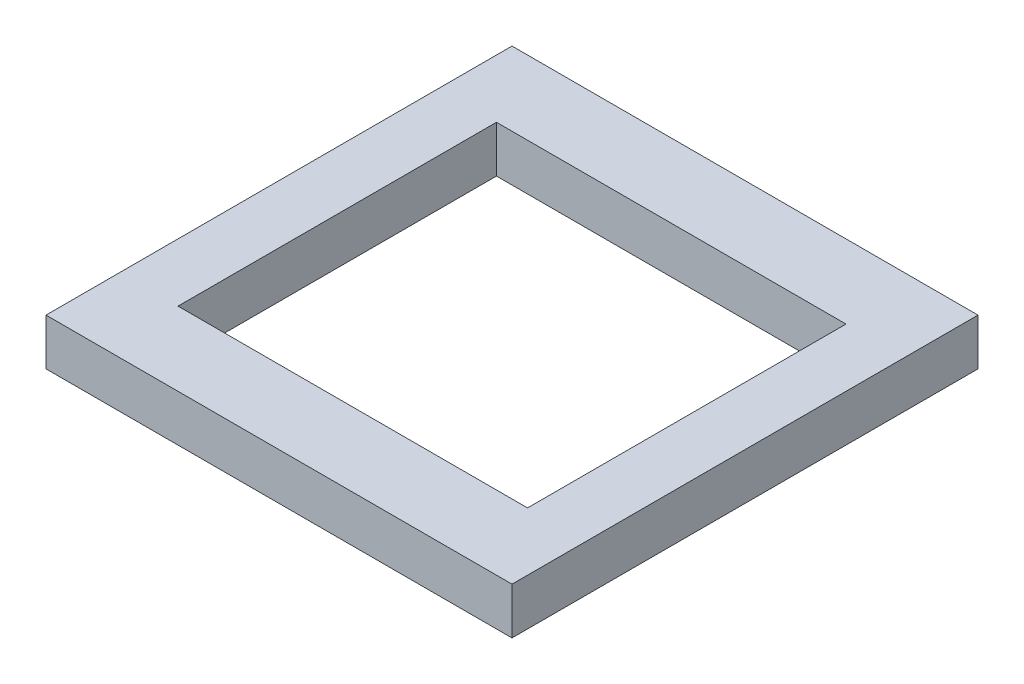
ISO-10303-21;
HEADER;
FILE_DESCRIPTION(('STEP AP214'),'2;1');
FILE_NAME('part.step','',(''),(''),'','','');
FILE_SCHEMA(('AUTOMOTIVE_DESIGN { 1 0 10303 214 1 1 1 1 }'));
ENDSEC;
DATA;
#1=APPLICATION_CONTEXT('core data for automotive mechanical design processes');
#2=APPLICATION_PROTOCOL_DEFINITION('international standard','automotive_design',2000,#1);
#3=PRODUCT_CONTEXT('',#1,'mechanical');
#4=PRODUCT('Part','Part','',(#3));
#5=PRODUCT_RELATED_PRODUCT_CATEGORY('part','',(#4));
#6=PRODUCT_DEFINITION_FORMATION('','',#4);
#7=PRODUCT_DEFINITION_CONTEXT('part definition',#1,'design');
#8=PRODUCT_DEFINITION('design','',#6,#7);
#9=PRODUCT_DEFINITION_SHAPE('','',#8);
#10=(LENGTH_UNIT() NAMED_UNIT(*) SI_UNIT(.MILLI.,.METRE.));
#11=(NAMED_UNIT(*) PLANE_ANGLE_UNIT() SI_UNIT($,.RADIAN.));
#12=(NAMED_UNIT(*) SI_UNIT($,.STERADIAN.) SOLID_ANGLE_UNIT());
#13=UNCERTAINTY_MEASURE_WITH_UNIT(LENGTH_MEASURE(1.E-05),#10,'distance_accuracy_value','');
#14=(GEOMETRIC_REPRESENTATION_CONTEXT(3) GLOBAL_UNCERTAINTY_ASSIGNED_CONTEXT((#13)) GLOBAL_UNIT_ASSIGNED_CONTEXT((#10,
#11,#12)) REPRESENTATION_CONTEXT('',''));
#15=CARTESIAN_POINT('',(0.,0.,0.));
#16=DIRECTION('',(0.,0.,1.));
#17=DIRECTION('',(1.,0.,0.));
#18=AXIS2_PLACEMENT_3D('',#15,#16,#17);
#19=CARTESIAN_POINT('',(0.,6.,0.));
#20=DIRECTION('',(0.,1.,0.));
#21=DIRECTION('',(0.,0.,1.));
#22=AXIS2_PLACEMENT_3D('',#19,#20,#21);
#23=PLANE('',#22);
#24=DIRECTION('',(0.,0.,-1.));
#25=VECTOR('',#24,1.);
#26=CARTESIAN_POINT('',(30.,6.,-30.));
#27=LINE('',#26,#25);
#28=CARTESIAN_POINT('',(30.,6.,30.));
#29=VERTEX_POINT('',#28);
#30=CARTESIAN_POINT('',(30.,6.,-30.));
#31=VERTEX_POINT('',#30);
#32=EDGE_CURVE('E153',#29,#31,#27,.T.);
#33=ORIENTED_EDGE('',*,*,#32,.T.);
#34=DIRECTION('',(-1.,0.,0.));
#35=VECTOR('',#34,1.);
#36=CARTESIAN_POINT('',(-30.,6.,-30.));
#37=LINE('',#36,#35);
#38=CARTESIAN_POINT('',(-30.,6.,-30.));
#39=VERTEX_POINT('',#38);
#40=EDGE_CURVE('E157',#31,#39,#37,.T.);
#41=ORIENTED_EDGE('',*,*,#40,.T.);
#42=DIRECTION('',(0.,0.,1.));
#43=VECTOR('',#42,1.);
#44=CARTESIAN_POINT('',(-30.,6.,-30.));
#45=LINE('',#44,#43);
#46=CARTESIAN_POINT('',(-30.,6.,30.));
#47=VERTEX_POINT('',#46);
#48=EDGE_CURVE('E161',#39,#47,#45,.T.);
#49=ORIENTED_EDGE('',*,*,#48,.T.);
#50=DIRECTION('',(1.,0.,0.));
#51=VECTOR('',#50,1.);
#52=CARTESIAN_POINT('',(-30.,6.,30.));
#53=LINE('',#52,#51);
#54=EDGE_CURVE('E164',#47,#29,#53,.T.);
#55=ORIENTED_EDGE('',*,*,#54,.T.);
#56=EDGE_LOOP('',(#33,#41,#49,#55));
#57=FACE_BOUND('',#56,.T.);
#58=DIRECTION('',(-1.,0.,0.));
#59=VECTOR('',#58,1.);
#60=CARTESIAN_POINT('',(-22.5,6.,-20.5));
#61=LINE('',#60,#59);
#62=CARTESIAN_POINT('',(22.5,6.,-20.5));
#63=VERTEX_POINT('',#62);
#64=CARTESIAN_POINT('',(-22.5,6.,-20.5));
#65=VERTEX_POINT('',#64);
#66=EDGE_CURVE('E114',#63,#65,#61,.T.);
#67=ORIENTED_EDGE('',*,*,#66,.F.);
#68=DIRECTION('',(0.,0.,-1.));
#69=VECTOR('',#68,1.);
#70=CARTESIAN_POINT('',(22.5,6.,-20.5));
#71=LINE('',#70,#69);
#72=CARTESIAN_POINT('',(22.5,6.,20.5));
#73=VERTEX_POINT('',#72);
#74=EDGE_CURVE('E105',#73,#63,#71,.T.);
#75=ORIENTED_EDGE('',*,*,#74,.F.);
#76=DIRECTION('',(1.,0.,0.));
#77=VECTOR('',#76,1.);
#78=CARTESIAN_POINT('',(-22.5,6.,20.5));
#79=LINE('',#78,#77);
#80=CARTESIAN_POINT('',(-22.5,6.,20.5));
#81=VERTEX_POINT('',#80);
#82=EDGE_CURVE('E131',#81,#73,#79,.T.);
#83=ORIENTED_EDGE('',*,*,#82,.F.);
#84=DIRECTION('',(0.,0.,1.));
#85=VECTOR('',#84,1.);
#86=CARTESIAN_POINT('',(-22.5,6.,-20.5));
#87=LINE('',#86,#85);
#88=EDGE_CURVE('E127',#65,#81,#87,.T.);
#89=ORIENTED_EDGE('',*,*,#88,.F.);
#90=EDGE_LOOP('',(#67,#75,#83,#89));
#91=FACE_BOUND('',#90,.T.);
#92=ADVANCED_FACE('F39',(#57,#91),#23,.T.);
#93=CARTESIAN_POINT('',(0.,0.,0.));
#94=DIRECTION('',(0.,1.,0.));
#95=DIRECTION('',(0.,0.,1.));
#96=AXIS2_PLACEMENT_3D('',#93,#94,#95);
#97=PLANE('',#96);
#98=DIRECTION('',(0.,0.,-1.));
#99=VECTOR('',#98,1.);
#100=CARTESIAN_POINT('',(30.,0.,-30.));
#101=LINE('',#100,#99);
#102=CARTESIAN_POINT('',(30.,0.,30.));
#103=VERTEX_POINT('',#102);
#104=CARTESIAN_POINT('',(30.,0.,-30.));
#105=VERTEX_POINT('',#104);
#106=EDGE_CURVE('E123',#103,#105,#101,.T.);
#107=ORIENTED_EDGE('',*,*,#106,.F.);
#108=DIRECTION('',(1.,0.,0.));
#109=VECTOR('',#108,1.);
#110=CARTESIAN_POINT('',(-30.,0.,30.));
#111=LINE('',#110,#109);
#112=CARTESIAN_POINT('',(-30.,0.,30.));
#113=VERTEX_POINT('',#112);
#114=EDGE_CURVE('E158',#113,#103,#111,.T.);
#115=ORIENTED_EDGE('',*,*,#114,.F.);
#116=DIRECTION('',(0.,0.,1.));
#117=VECTOR('',#116,1.);
#118=CARTESIAN_POINT('',(-30.,0.,-30.));
#119=LINE('',#118,#117);
#120=CARTESIAN_POINT('',(-30.,0.,-30.));
#121=VERTEX_POINT('',#120);
#122=EDGE_CURVE('E174',#121,#113,#119,.T.);
#123=ORIENTED_EDGE('',*,*,#122,.F.);
#124=DIRECTION('',(-1.,0.,0.));
#125=VECTOR('',#124,1.);
#126=CARTESIAN_POINT('',(-30.,0.,-30.));
#127=LINE('',#126,#125);
#128=EDGE_CURVE('E171',#105,#121,#127,.T.);
#129=ORIENTED_EDGE('',*,*,#128,.F.);
#130=EDGE_LOOP('',(#107,#115,#123,#129));
#131=FACE_BOUND('',#130,.T.);
#132=DIRECTION('',(0.,0.,-1.));
#133=VECTOR('',#132,1.);
#134=CARTESIAN_POINT('',(22.5,0.,-20.5));
#135=LINE('',#134,#133);
#136=CARTESIAN_POINT('',(22.5,0.,20.5));
#137=VERTEX_POINT('',#136);
#138=CARTESIAN_POINT('',(22.5,0.,-20.5));
#139=VERTEX_POINT('',#138);
#140=EDGE_CURVE('E63',#137,#139,#135,.T.);
#141=ORIENTED_EDGE('',*,*,#140,.T.);
#142=DIRECTION('',(-1.,0.,0.));
#143=VECTOR('',#142,1.);
#144=CARTESIAN_POINT('',(-22.5,0.,-20.5));
#145=LINE('',#144,#143);
#146=CARTESIAN_POINT('',(-22.5,0.,-20.5));
#147=VERTEX_POINT('',#146);
#148=EDGE_CURVE('E121',#139,#147,#145,.T.);
#149=ORIENTED_EDGE('',*,*,#148,.T.);
#150=DIRECTION('',(0.,0.,1.));
#151=VECTOR('',#150,1.);
#152=CARTESIAN_POINT('',(-22.5,0.,-20.5));
#153=LINE('',#152,#151);
#154=CARTESIAN_POINT('',(-22.5,0.,20.5));
#155=VERTEX_POINT('',#154);
#156=EDGE_CURVE('E140',#147,#155,#153,.T.);
#157=ORIENTED_EDGE('',*,*,#156,.T.);
#158=DIRECTION('',(1.,0.,0.));
#159=VECTOR('',#158,1.);
#160=CARTESIAN_POINT('',(-22.5,0.,20.5));
#161=LINE('',#160,#159);
#162=EDGE_CURVE('E115',#155,#137,#161,.T.);
#163=ORIENTED_EDGE('',*,*,#162,.T.);
#164=EDGE_LOOP('',(#141,#149,#157,#163));
#165=FACE_BOUND('',#164,.T.);
#166=ADVANCED_FACE('F197',(#131,#165),#97,.F.);
#167=CARTESIAN_POINT('',(30.,6.,-30.));
#168=DIRECTION('',(-1.,0.,0.));
#169=DIRECTION('',(0.,0.,1.));
#170=AXIS2_PLACEMENT_3D('',#167,#168,#169);
#171=PLANE('',#170);
#172=ORIENTED_EDGE('',*,*,#106,.T.);
#173=DIRECTION('',(0.,-1.,0.));
#174=VECTOR('',#173,1.);
#175=CARTESIAN_POINT('',(30.,6.,-30.));
#176=LINE('',#175,#174);
#177=EDGE_CURVE('E11',#31,#105,#176,.T.);
#178=ORIENTED_EDGE('',*,*,#177,.F.);
#179=ORIENTED_EDGE('',*,*,#32,.F.);
#180=DIRECTION('',(0.,-1.,0.));
#181=VECTOR('',#180,1.);
#182=CARTESIAN_POINT('',(30.,6.,30.));
#183=LINE('',#182,#181);
#184=EDGE_CURVE('E167',#29,#103,#183,.T.);
#185=ORIENTED_EDGE('',*,*,#184,.T.);
#186=EDGE_LOOP('',(#172,#178,#179,#185));
#187=FACE_BOUND('',#186,.T.);
#188=ADVANCED_FACE('F41',(#187),#171,.F.);
#189=CARTESIAN_POINT('',(-30.,6.,-30.));
#190=DIRECTION('',(0.,0.,1.));
#191=DIRECTION('',(1.,0.,0.));
#192=AXIS2_PLACEMENT_3D('',#189,#190,#191);
#193=PLANE('',#192);
#194=ORIENTED_EDGE('',*,*,#128,.T.);
#195=DIRECTION('',(0.,-1.,0.));
#196=VECTOR('',#195,1.);
#197=CARTESIAN_POINT('',(-30.,6.,-30.));
#198=LINE('',#197,#196);
#199=EDGE_CURVE('E48',#39,#121,#198,.T.);
#200=ORIENTED_EDGE('',*,*,#199,.F.);
#201=ORIENTED_EDGE('',*,*,#40,.F.);
#202=ORIENTED_EDGE('',*,*,#177,.T.);
#203=EDGE_LOOP('',(#194,#200,#201,#202));
#204=FACE_BOUND('',#203,.T.);
#205=ADVANCED_FACE('F207',(#204),#193,.F.);
#206=CARTESIAN_POINT('',(-30.,6.,-30.));
#207=DIRECTION('',(1.,0.,0.));
#208=DIRECTION('',(0.,0.,-1.));
#209=AXIS2_PLACEMENT_3D('',#206,#207,#208);
#210=PLANE('',#209);
#211=ORIENTED_EDGE('',*,*,#122,.T.);
#212=DIRECTION('',(0.,-1.,0.));
#213=VECTOR('',#212,1.);
#214=CARTESIAN_POINT('',(-30.,6.,30.));
#215=LINE('',#214,#213);
#216=EDGE_CURVE('E182',#47,#113,#215,.T.);
#217=ORIENTED_EDGE('',*,*,#216,.F.);
#218=ORIENTED_EDGE('',*,*,#48,.F.);
#219=ORIENTED_EDGE('',*,*,#199,.T.);
#220=EDGE_LOOP('',(#211,#217,#218,#219));
#221=FACE_BOUND('',#220,.T.);
#222=ADVANCED_FACE('F191',(#221),#210,.F.);
#223=CARTESIAN_POINT('',(-30.,6.,30.));
#224=DIRECTION('',(0.,0.,-1.));
#225=DIRECTION('',(-1.,0.,0.));
#226=AXIS2_PLACEMENT_3D('',#223,#224,#225);
#227=PLANE('',#226);
#228=ORIENTED_EDGE('',*,*,#114,.T.);
#229=ORIENTED_EDGE('',*,*,#184,.F.);
#230=ORIENTED_EDGE('',*,*,#54,.F.);
#231=ORIENTED_EDGE('',*,*,#216,.T.);
#232=EDGE_LOOP('',(#228,#229,#230,#231));
#233=FACE_BOUND('',#232,.T.);
#234=ADVANCED_FACE('F201',(#233),#227,.F.);
#235=CARTESIAN_POINT('',(22.5,6.,-20.5));
#236=DIRECTION('',(-1.,0.,0.));
#237=DIRECTION('',(0.,0.,1.));
#238=AXIS2_PLACEMENT_3D('',#235,#236,#237);
#239=PLANE('',#238);
#240=ORIENTED_EDGE('',*,*,#140,.F.);
#241=DIRECTION('',(0.,-1.,0.));
#242=VECTOR('',#241,1.);
#243=CARTESIAN_POINT('',(22.5,6.,20.5));
#244=LINE('',#243,#242);
#245=EDGE_CURVE('E109',#73,#137,#244,.T.);
#246=ORIENTED_EDGE('',*,*,#245,.F.);
#247=ORIENTED_EDGE('',*,*,#74,.T.);
#248=DIRECTION('',(0.,-1.,0.));
#249=VECTOR('',#248,1.);
#250=CARTESIAN_POINT('',(22.5,6.,-20.5));
#251=LINE('',#250,#249);
#252=EDGE_CURVE('E108',#63,#139,#251,.T.);
#253=ORIENTED_EDGE('',*,*,#252,.T.);
#254=EDGE_LOOP('',(#240,#246,#247,#253));
#255=FACE_BOUND('',#254,.T.);
#256=ADVANCED_FACE('F107',(#255),#239,.T.);
#257=CARTESIAN_POINT('',(-22.5,6.,-20.5));
#258=DIRECTION('',(0.,0.,1.));
#259=DIRECTION('',(1.,0.,0.));
#260=AXIS2_PLACEMENT_3D('',#257,#258,#259);
#261=PLANE('',#260);
#262=ORIENTED_EDGE('',*,*,#148,.F.);
#263=ORIENTED_EDGE('',*,*,#252,.F.);
#264=ORIENTED_EDGE('',*,*,#66,.T.);
#265=DIRECTION('',(0.,-1.,0.));
#266=VECTOR('',#265,1.);
#267=CARTESIAN_POINT('',(-22.5,6.,-20.5));
#268=LINE('',#267,#266);
#269=EDGE_CURVE('E124',#65,#147,#268,.T.);
#270=ORIENTED_EDGE('',*,*,#269,.T.);
#271=EDGE_LOOP('',(#262,#263,#264,#270));
#272=FACE_BOUND('',#271,.T.);
#273=ADVANCED_FACE('F118',(#272),#261,.T.);
#274=CARTESIAN_POINT('',(-22.5,6.,-20.5));
#275=DIRECTION('',(1.,0.,0.));
#276=DIRECTION('',(0.,0.,-1.));
#277=AXIS2_PLACEMENT_3D('',#274,#275,#276);
#278=PLANE('',#277);
#279=ORIENTED_EDGE('',*,*,#156,.F.);
#280=ORIENTED_EDGE('',*,*,#269,.F.);
#281=ORIENTED_EDGE('',*,*,#88,.T.);
#282=DIRECTION('',(0.,-1.,0.));
#283=VECTOR('',#282,1.);
#284=CARTESIAN_POINT('',(-22.5,6.,20.5));
#285=LINE('',#284,#283);
#286=EDGE_CURVE('E55',#81,#155,#285,.T.);
#287=ORIENTED_EDGE('',*,*,#286,.T.);
#288=EDGE_LOOP('',(#279,#280,#281,#287));
#289=FACE_BOUND('',#288,.T.);
#290=ADVANCED_FACE('F230',(#289),#278,.T.);
#291=CARTESIAN_POINT('',(-22.5,6.,20.5));
#292=DIRECTION('',(0.,0.,-1.));
#293=DIRECTION('',(-1.,0.,0.));
#294=AXIS2_PLACEMENT_3D('',#291,#292,#293);
#295=PLANE('',#294);
#296=ORIENTED_EDGE('',*,*,#162,.F.);
#297=ORIENTED_EDGE('',*,*,#286,.F.);
#298=ORIENTED_EDGE('',*,*,#82,.T.);
#299=ORIENTED_EDGE('',*,*,#245,.T.);
#300=EDGE_LOOP('',(#296,#297,#298,#299));
#301=FACE_BOUND('',#300,.T.);
#302=ADVANCED_FACE('F234',(#301),#295,.T.);
#303=CLOSED_SHELL('',(#92,#166,#188,#205,#222,#234,#256,#273,#290,#302));
#304=MANIFOLD_SOLID_BREP('B2',#303);
#305=ADVANCED_BREP_SHAPE_REPRESENTATION('',(#18,#304),#14);
#306=SHAPE_DEFINITION_REPRESENTATION(#9,#305);
ENDSEC;
END-ISO-10303-21;
